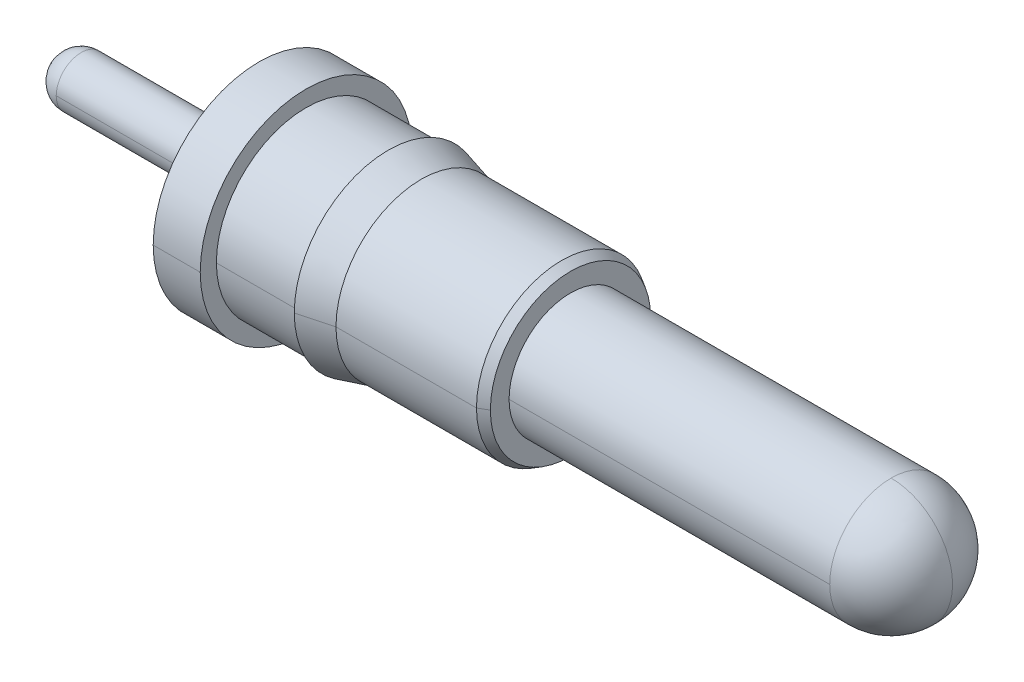
ISO-10303-21;
HEADER;
FILE_DESCRIPTION(('STEP AP214'),'2;1');
FILE_NAME('part.step','',(''),(''),'','','');
FILE_SCHEMA(('AUTOMOTIVE_DESIGN { 1 0 10303 214 1 1 1 1 }'));
ENDSEC;
DATA;
#1=APPLICATION_CONTEXT('core data for automotive mechanical design processes');
#2=APPLICATION_PROTOCOL_DEFINITION('international standard','automotive_design',2000,#1);
#3=PRODUCT_CONTEXT('',#1,'mechanical');
#4=PRODUCT('Part','Part','',(#3));
#5=PRODUCT_RELATED_PRODUCT_CATEGORY('part','',(#4));
#6=PRODUCT_DEFINITION_FORMATION('','',#4);
#7=PRODUCT_DEFINITION_CONTEXT('part definition',#1,'design');
#8=PRODUCT_DEFINITION('design','',#6,#7);
#9=PRODUCT_DEFINITION_SHAPE('','',#8);
#10=(LENGTH_UNIT() NAMED_UNIT(*) SI_UNIT(.MILLI.,.METRE.));
#11=(NAMED_UNIT(*) PLANE_ANGLE_UNIT() SI_UNIT($,.RADIAN.));
#12=(NAMED_UNIT(*) SI_UNIT($,.STERADIAN.) SOLID_ANGLE_UNIT());
#13=UNCERTAINTY_MEASURE_WITH_UNIT(LENGTH_MEASURE(1.E-05),#10,'distance_accuracy_value','');
#14=(GEOMETRIC_REPRESENTATION_CONTEXT(3) GLOBAL_UNCERTAINTY_ASSIGNED_CONTEXT((#13)) GLOBAL_UNIT_ASSIGNED_CONTEXT((#10,
#11,#12)) REPRESENTATION_CONTEXT('',''));
#15=CARTESIAN_POINT('',(0.,0.,0.));
#16=DIRECTION('',(0.,0.,1.));
#17=DIRECTION('',(1.,0.,0.));
#18=AXIS2_PLACEMENT_3D('',#15,#16,#17);
#19=CARTESIAN_POINT('',(0.215900000000005,0.215900000000005,0.));
#20=CARTESIAN_POINT('',(0.215900000000005,0.215900000000005,0.));
#21=CARTESIAN_POINT('',(0.215900000000005,0.215900000000005,0.));
#22=CARTESIAN_POINT('',(0.215900000000005,0.215900000000005,0.));
#23=CARTESIAN_POINT('',(0.215900000000004,0.215900000000005,-0.431800000000009));
#24=CARTESIAN_POINT('',(-0.647700000000014,0.215900000000005,-0.43180000000001));
#25=CARTESIAN_POINT('',(-0.647700000000014,0.215900000000005,0.43180000000001));
#26=CARTESIAN_POINT('',(0.215900000000005,0.215900000000005,0.431800000000009));
#27=CARTESIAN_POINT('',(0.215900000000004,-0.215900000000005,-0.431800000000009));
#28=CARTESIAN_POINT('',(-0.647700000000014,-0.215900000000005,-0.43180000000001));
#29=CARTESIAN_POINT('',(-0.647700000000014,-0.215900000000005,0.43180000000001));
#30=CARTESIAN_POINT('',(0.215900000000005,-0.215900000000005,0.431800000000009));
#31=CARTESIAN_POINT('',(0.215900000000005,-0.215900000000005,0.));
#32=CARTESIAN_POINT('',(0.215900000000005,-0.215900000000005,0.));
#33=CARTESIAN_POINT('',(0.215900000000005,-0.215900000000005,0.));
#34=CARTESIAN_POINT('',(0.215900000000005,-0.215900000000005,0.));
#35=(BOUNDED_SURFACE() B_SPLINE_SURFACE(3,3,((#19,#20,#21,#22),(#23,#24,#25,#26),(#27,#28,#29,
#30),(#31,#32,#33,#34)),.UNSPECIFIED.,.F.,.F.,.F.) B_SPLINE_SURFACE_WITH_KNOTS((4,4),(4,4),(0.,
1.),(0.,1.),.UNSPECIFIED.) GEOMETRIC_REPRESENTATION_ITEM() RATIONAL_B_SPLINE_SURFACE(((1.,
0.333333333333334,0.333333333333334,1.),(0.333333333333334,0.111111111111111,0.111111111111111,
0.333333333333334),(0.333333333333334,0.111111111111111,0.111111111111111,0.333333333333334),
(1.,0.333333333333334,0.333333333333334,1.))) REPRESENTATION_ITEM('') SURFACE());
#36=CARTESIAN_POINT('',(0.215900000000005,0.,0.));
#37=DIRECTION('',(1.,0.,0.));
#38=DIRECTION('',(0.,0.,1.));
#39=AXIS2_PLACEMENT_3D('',#36,#37,#38);
#40=CIRCLE('',#39,0.215900000000005);
#41=CARTESIAN_POINT('',(0.215900000000005,-0.215900000000005,0.));
#42=VERTEX_POINT('',#41);
#43=CARTESIAN_POINT('',(0.215900000000005,0.,-0.215900000000005));
#44=VERTEX_POINT('',#43);
#45=EDGE_CURVE('E10',#42,#44,#40,.T.);
#46=CARTESIAN_POINT('',(0.215900000000005,0.,0.));
#47=DIRECTION('',(1.,0.,0.));
#48=DIRECTION('',(0.,0.,1.));
#49=AXIS2_PLACEMENT_3D('',#46,#47,#48);
#50=CIRCLE('',#49,0.215900000000005);
#51=CARTESIAN_POINT('',(0.215900000000005,0.,0.215900000000005));
#52=VERTEX_POINT('',#51);
#53=EDGE_CURVE('E21',#52,#42,#50,.T.);
#54=CARTESIAN_POINT('',(0.215900000000005,0.,0.));
#55=DIRECTION('',(1.,0.,0.));
#56=DIRECTION('',(0.,0.,1.));
#57=AXIS2_PLACEMENT_3D('',#54,#55,#56);
#58=CIRCLE('',#57,0.215900000000005);
#59=CARTESIAN_POINT('',(0.215900000000005,0.215900000000005,0.));
#60=VERTEX_POINT('',#59);
#61=EDGE_CURVE('E284',#60,#52,#58,.T.);
#62=CARTESIAN_POINT('',(0.215900000000005,0.,0.));
#63=DIRECTION('',(1.,0.,0.));
#64=DIRECTION('',(0.,0.,1.));
#65=AXIS2_PLACEMENT_3D('',#62,#63,#64);
#66=CIRCLE('',#65,0.215900000000005);
#67=EDGE_CURVE('E280',#44,#60,#66,.T.);
#68=ORIENTED_EDGE('',*,*,#45,.F.);
#69=ORIENTED_EDGE('',*,*,#53,.F.);
#70=ORIENTED_EDGE('',*,*,#61,.F.);
#71=ORIENTED_EDGE('',*,*,#67,.F.);
#72=EDGE_LOOP('',(#68,#69,#70,#71));
#73=FACE_BOUND('',#72,.T.);
#74=ADVANCED_FACE('F16',(#73),#35,.T.);
#75=CARTESIAN_POINT('',(0.,0.,0.));
#76=DIRECTION('',(-1.,0.,0.));
#77=DIRECTION('',(0.,0.,1.));
#78=AXIS2_PLACEMENT_3D('',#75,#76,#77);
#79=CYLINDRICAL_SURFACE('',#78,0.215900000000005);
#80=DIRECTION('',(-1.,0.,0.));
#81=VECTOR('',#80,1.);
#82=CARTESIAN_POINT('',(0.,0.,-0.215900000000005));
#83=LINE('',#82,#81);
#84=CARTESIAN_POINT('',(1.67640000000003,0.,-0.215900000000005));
#85=VERTEX_POINT('',#84);
#86=EDGE_CURVE('E285',#85,#44,#83,.T.);
#87=ORIENTED_EDGE('',*,*,#86,.F.);
#88=CARTESIAN_POINT('',(1.67640000000003,0.,0.));
#89=DIRECTION('',(-1.,0.,0.));
#90=DIRECTION('',(0.,0.,1.));
#91=AXIS2_PLACEMENT_3D('',#88,#89,#90);
#92=CIRCLE('',#91,0.215900000000005);
#93=CARTESIAN_POINT('',(1.67640000000003,0.,0.215900000000005));
#94=VERTEX_POINT('',#93);
#95=EDGE_CURVE('E339',#85,#94,#92,.T.);
#96=ORIENTED_EDGE('',*,*,#95,.T.);
#97=DIRECTION('',(-1.,0.,0.));
#98=VECTOR('',#97,1.);
#99=CARTESIAN_POINT('',(0.,0.,0.215900000000005));
#100=LINE('',#99,#98);
#101=EDGE_CURVE('E312',#94,#52,#100,.T.);
#102=ORIENTED_EDGE('',*,*,#101,.T.);
#103=ORIENTED_EDGE('',*,*,#53,.T.);
#104=ORIENTED_EDGE('',*,*,#45,.T.);
#105=EDGE_LOOP('',(#87,#96,#102,#103,#104));
#106=FACE_BOUND('',#105,.T.);
#107=ADVANCED_FACE('F352',(#106),#79,.T.);
#108=CARTESIAN_POINT('',(1.75260000000003,0.,-0.292100000000005));
#109=CARTESIAN_POINT('',(1.75260000000003,-0.584200000000011,-0.292100000000005));
#110=CARTESIAN_POINT('',(1.75260000000003,-0.584200000000011,0.292100000000005));
#111=CARTESIAN_POINT('',(1.75260000000003,0.,0.292100000000005));
#112=CARTESIAN_POINT('',(1.75260000000003,0.,-0.247463073452835));
#113=CARTESIAN_POINT('',(1.75260000000003,-0.494926146905669,-0.247463073452835));
#114=CARTESIAN_POINT('',(1.75260000000003,-0.494926146905669,0.247463073452835));
#115=CARTESIAN_POINT('',(1.75260000000003,0.,0.247463073452835));
#116=CARTESIAN_POINT('',(1.7210369265472,0.,-0.215900000000005));
#117=CARTESIAN_POINT('',(1.7210369265472,-0.431800000000009,-0.215900000000005));
#118=CARTESIAN_POINT('',(1.7210369265472,-0.431800000000009,0.215900000000005));
#119=CARTESIAN_POINT('',(1.7210369265472,0.,0.215900000000005));
#120=CARTESIAN_POINT('',(1.67640000000003,0.,-0.215900000000005));
#121=CARTESIAN_POINT('',(1.67640000000003,-0.431800000000009,-0.215900000000005));
#122=CARTESIAN_POINT('',(1.67640000000003,-0.431800000000009,0.215900000000005));
#123=CARTESIAN_POINT('',(1.67640000000003,0.,0.215900000000005));
#124=(BOUNDED_SURFACE() B_SPLINE_SURFACE(3,3,((#108,#109,#110,#111),(#112,#113,#114,#115),(#116,
#117,#118,#119),(#120,#121,#122,#123)),.UNSPECIFIED.,.F.,.F.,
.F.) B_SPLINE_SURFACE_WITH_KNOTS((4,4),(4,4),(0.,1.),(0.,1.),
.UNSPECIFIED.) GEOMETRIC_REPRESENTATION_ITEM() RATIONAL_B_SPLINE_SURFACE(((1.,0.333333333333334,
0.333333333333334,1.),(0.804737854124365,0.268245951374788,0.268245951374788,0.804737854124365),
(0.804737854124365,0.268245951374788,0.268245951374788,0.804737854124365),(1.,0.333333333333334,
0.333333333333334,1.))) REPRESENTATION_ITEM('') SURFACE());
#125=CARTESIAN_POINT('',(1.67640000000003,0.,-0.292100000000005));
#126=DIRECTION('',(0.,-1.,0.));
#127=DIRECTION('',(0.,0.,-1.));
#128=AXIS2_PLACEMENT_3D('',#125,#126,#127);
#129=CIRCLE('',#128,0.0762);
#130=CARTESIAN_POINT('',(1.75260000000003,0.,-0.292100000000005));
#131=VERTEX_POINT('',#130);
#132=EDGE_CURVE('E207',#131,#85,#129,.T.);
#133=CARTESIAN_POINT('',(1.75260000000003,0.,-0.292100000000005));
#134=CARTESIAN_POINT('',(1.75260000000003,-0.584200000000011,-0.292100000000005));
#135=CARTESIAN_POINT('',(1.75260000000003,-0.584200000000011,0.292100000000005));
#136=CARTESIAN_POINT('',(1.75260000000003,0.,0.292100000000005));
#137=(BOUNDED_CURVE() B_SPLINE_CURVE(3,(#133,#134,#135,#136),.UNSPECIFIED.,.F.,
.F.) B_SPLINE_CURVE_WITH_KNOTS((4,4),(0.,1.),
.UNSPECIFIED.) CURVE() GEOMETRIC_REPRESENTATION_ITEM() RATIONAL_B_SPLINE_CURVE((1.,
0.333333333333334,0.333333333333334,1.)) REPRESENTATION_ITEM(''));
#138=CARTESIAN_POINT('',(1.75260000000003,0.,0.292100000000005));
#139=VERTEX_POINT('',#138);
#140=EDGE_CURVE('E335',#131,#139,#137,.T.);
#141=CARTESIAN_POINT('',(1.67640000000003,0.,0.292100000000005));
#142=DIRECTION('',(0.,1.,0.));
#143=DIRECTION('',(0.,0.,1.));
#144=AXIS2_PLACEMENT_3D('',#141,#142,#143);
#145=CIRCLE('',#144,0.0762);
#146=EDGE_CURVE('E206',#139,#94,#145,.T.);
#147=ORIENTED_EDGE('',*,*,#132,.F.);
#148=ORIENTED_EDGE('',*,*,#140,.T.);
#149=ORIENTED_EDGE('',*,*,#146,.T.);
#150=ORIENTED_EDGE('',*,*,#95,.F.);
#151=EDGE_LOOP('',(#147,#148,#149,#150));
#152=FACE_BOUND('',#151,.T.);
#153=ADVANCED_FACE('F362',(#152),#124,.F.);
#154=CARTESIAN_POINT('',(1.75260000000003,0.9144,0.));
#155=DIRECTION('',(1.,0.,0.));
#156=DIRECTION('',(0.,1.,0.));
#157=AXIS2_PLACEMENT_3D('',#154,#155,#156);
#158=PLANE('',#157);
#159=ORIENTED_EDGE('',*,*,#140,.F.);
#160=CARTESIAN_POINT('',(1.75260000000003,0.,0.292100000000005));
#161=CARTESIAN_POINT('',(1.75260000000003,0.584200000000011,0.292100000000005));
#162=CARTESIAN_POINT('',(1.75260000000003,0.584200000000011,-0.292100000000005));
#163=CARTESIAN_POINT('',(1.75260000000003,0.,-0.292100000000005));
#164=(BOUNDED_CURVE() B_SPLINE_CURVE(3,(#160,#161,#162,#163),.UNSPECIFIED.,.F.,
.F.) B_SPLINE_CURVE_WITH_KNOTS((4,4),(0.,1.),
.UNSPECIFIED.) CURVE() GEOMETRIC_REPRESENTATION_ITEM() RATIONAL_B_SPLINE_CURVE((1.,
0.333333333333334,0.333333333333334,1.)) REPRESENTATION_ITEM(''));
#165=EDGE_CURVE('E201',#139,#131,#164,.T.);
#166=ORIENTED_EDGE('',*,*,#165,.F.);
#167=EDGE_LOOP('',(#159,#166));
#168=FACE_BOUND('',#167,.T.);
#169=CARTESIAN_POINT('',(1.75260000000003,0.,0.));
#170=DIRECTION('',(1.,0.,0.));
#171=DIRECTION('',(0.,0.,1.));
#172=AXIS2_PLACEMENT_3D('',#169,#170,#171);
#173=CIRCLE('',#172,0.9144);
#174=CARTESIAN_POINT('',(1.75260000000003,0.,0.9144));
#175=VERTEX_POINT('',#174);
#176=CARTESIAN_POINT('',(1.75260000000003,0.,-0.9144));
#177=VERTEX_POINT('',#176);
#178=EDGE_CURVE('E332',#175,#177,#173,.T.);
#179=ORIENTED_EDGE('',*,*,#178,.F.);
#180=CARTESIAN_POINT('',(1.75260000000003,0.,0.));
#181=DIRECTION('',(1.,0.,0.));
#182=DIRECTION('',(0.,0.,1.));
#183=AXIS2_PLACEMENT_3D('',#180,#181,#182);
#184=CIRCLE('',#183,0.9144);
#185=EDGE_CURVE('E293',#177,#175,#184,.T.);
#186=ORIENTED_EDGE('',*,*,#185,.F.);
#187=EDGE_LOOP('',(#179,#186));
#188=FACE_BOUND('',#187,.T.);
#189=ADVANCED_FACE('F364',(#168,#188),#158,.F.);
#190=CARTESIAN_POINT('',(0.,0.,0.));
#191=DIRECTION('',(-1.,0.,0.));
#192=DIRECTION('',(0.,0.,1.));
#193=AXIS2_PLACEMENT_3D('',#190,#191,#192);
#194=CYLINDRICAL_SURFACE('',#193,0.9144);
#195=DIRECTION('',(-1.,0.,0.));
#196=VECTOR('',#195,1.);
#197=CARTESIAN_POINT('',(0.,0.,-0.9144));
#198=LINE('',#197,#196);
#199=CARTESIAN_POINT('',(2.15900000000003,0.,-0.9144));
#200=VERTEX_POINT('',#199);
#201=EDGE_CURVE('E288',#200,#177,#198,.T.);
#202=ORIENTED_EDGE('',*,*,#201,.F.);
#203=CARTESIAN_POINT('',(2.15900000000003,0.,0.));
#204=DIRECTION('',(-1.,0.,0.));
#205=DIRECTION('',(0.,0.,1.));
#206=AXIS2_PLACEMENT_3D('',#203,#204,#205);
#207=CIRCLE('',#206,0.9144);
#208=CARTESIAN_POINT('',(2.15900000000003,0.,0.9144));
#209=VERTEX_POINT('',#208);
#210=EDGE_CURVE('E329',#200,#209,#207,.T.);
#211=ORIENTED_EDGE('',*,*,#210,.T.);
#212=DIRECTION('',(-1.,0.,0.));
#213=VECTOR('',#212,1.);
#214=CARTESIAN_POINT('',(0.,0.,0.9144));
#215=LINE('',#214,#213);
#216=EDGE_CURVE('E297',#209,#175,#215,.T.);
#217=ORIENTED_EDGE('',*,*,#216,.T.);
#218=ORIENTED_EDGE('',*,*,#178,.T.);
#219=EDGE_LOOP('',(#202,#211,#217,#218));
#220=FACE_BOUND('',#219,.T.);
#221=ADVANCED_FACE('F367',(#220),#194,.T.);
#222=CARTESIAN_POINT('',(2.15900000000003,0.9144,0.));
#223=DIRECTION('',(-1.,0.,0.));
#224=DIRECTION('',(0.,0.,1.));
#225=AXIS2_PLACEMENT_3D('',#222,#223,#224);
#226=PLANE('',#225);
#227=CARTESIAN_POINT('',(2.15900000000003,0.,0.));
#228=DIRECTION('',(1.,0.,0.));
#229=DIRECTION('',(0.,0.,1.));
#230=AXIS2_PLACEMENT_3D('',#227,#228,#229);
#231=CIRCLE('',#230,0.7747);
#232=CARTESIAN_POINT('',(2.15900000000003,0.,0.7747));
#233=VERTEX_POINT('',#232);
#234=CARTESIAN_POINT('',(2.15900000000003,0.,-0.7747));
#235=VERTEX_POINT('',#234);
#236=EDGE_CURVE('E326',#233,#235,#231,.T.);
#237=ORIENTED_EDGE('',*,*,#236,.F.);
#238=CARTESIAN_POINT('',(2.15900000000003,0.,0.));
#239=DIRECTION('',(1.,0.,0.));
#240=DIRECTION('',(0.,0.,1.));
#241=AXIS2_PLACEMENT_3D('',#238,#239,#240);
#242=CIRCLE('',#241,0.7747);
#243=EDGE_CURVE('E271',#235,#233,#242,.T.);
#244=ORIENTED_EDGE('',*,*,#243,.F.);
#245=EDGE_LOOP('',(#237,#244));
#246=FACE_BOUND('',#245,.T.);
#247=CARTESIAN_POINT('',(2.15900000000003,0.,0.));
#248=DIRECTION('',(-1.,0.,0.));
#249=DIRECTION('',(0.,0.,1.));
#250=AXIS2_PLACEMENT_3D('',#247,#248,#249);
#251=CIRCLE('',#250,0.9144);
#252=EDGE_CURVE('E279',#209,#200,#251,.T.);
#253=ORIENTED_EDGE('',*,*,#252,.F.);
#254=ORIENTED_EDGE('',*,*,#210,.F.);
#255=EDGE_LOOP('',(#253,#254));
#256=FACE_BOUND('',#255,.T.);
#257=ADVANCED_FACE('F377',(#246,#256),#226,.F.);
#258=CARTESIAN_POINT('',(0.,0.,0.));
#259=DIRECTION('',(-1.,0.,0.));
#260=DIRECTION('',(0.,0.,1.));
#261=AXIS2_PLACEMENT_3D('',#258,#259,#260);
#262=CYLINDRICAL_SURFACE('',#261,0.7747);
#263=DIRECTION('',(-1.,0.,0.));
#264=VECTOR('',#263,1.);
#265=CARTESIAN_POINT('',(0.,0.,-0.7747));
#266=LINE('',#265,#264);
#267=CARTESIAN_POINT('',(2.8702,0.,-0.7747));
#268=VERTEX_POINT('',#267);
#269=EDGE_CURVE('E267',#268,#235,#266,.T.);
#270=ORIENTED_EDGE('',*,*,#269,.F.);
#271=CARTESIAN_POINT('',(2.8702,0.,0.));
#272=DIRECTION('',(-1.,0.,0.));
#273=DIRECTION('',(0.,0.,1.));
#274=AXIS2_PLACEMENT_3D('',#271,#272,#273);
#275=CIRCLE('',#274,0.7747);
#276=CARTESIAN_POINT('',(2.8702,0.,0.7747));
#277=VERTEX_POINT('',#276);
#278=EDGE_CURVE('E304',#268,#277,#275,.T.);
#279=ORIENTED_EDGE('',*,*,#278,.T.);
#280=DIRECTION('',(-1.,0.,0.));
#281=VECTOR('',#280,1.);
#282=CARTESIAN_POINT('',(0.,0.,0.7747));
#283=LINE('',#282,#281);
#284=EDGE_CURVE('E275',#277,#233,#283,.T.);
#285=ORIENTED_EDGE('',*,*,#284,.T.);
#286=ORIENTED_EDGE('',*,*,#236,.T.);
#287=EDGE_LOOP('',(#270,#279,#285,#286));
#288=FACE_BOUND('',#287,.T.);
#289=ADVANCED_FACE('F379',(#288),#262,.T.);
#290=CARTESIAN_POINT('',(2.8702,0.7747,0.));
#291=DIRECTION('',(1.,0.,0.));
#292=DIRECTION('',(0.,1.,0.));
#293=AXIS2_PLACEMENT_3D('',#290,#291,#292);
#294=PLANE('',#293);
#295=CARTESIAN_POINT('',(2.8702,0.,0.));
#296=DIRECTION('',(-1.,0.,0.));
#297=DIRECTION('',(0.,0.,1.));
#298=AXIS2_PLACEMENT_3D('',#295,#296,#297);
#299=CIRCLE('',#298,0.7747);
#300=EDGE_CURVE('E241',#277,#268,#299,.T.);
#301=ORIENTED_EDGE('',*,*,#300,.F.);
#302=ORIENTED_EDGE('',*,*,#278,.F.);
#303=EDGE_LOOP('',(#301,#302));
#304=FACE_BOUND('',#303,.T.);
#305=CARTESIAN_POINT('',(2.87020000001803,0.,0.));
#306=DIRECTION('',(1.,0.,0.));
#307=DIRECTION('',(0.,0.,1.));
#308=AXIS2_PLACEMENT_3D('',#305,#306,#307);
#309=CIRCLE('',#308,0.812799999979228);
#310=CARTESIAN_POINT('',(2.87020000001803,0.,0.812799999979228));
#311=VERTEX_POINT('',#310);
#312=CARTESIAN_POINT('',(2.87020000001803,0.,-0.812799999979228));
#313=VERTEX_POINT('',#312);
#314=EDGE_CURVE('E301',#311,#313,#309,.T.);
#315=ORIENTED_EDGE('',*,*,#314,.F.);
#316=CARTESIAN_POINT('',(2.87020000001803,0.,0.));
#317=DIRECTION('',(1.,0.,0.));
#318=DIRECTION('',(0.,0.,1.));
#319=AXIS2_PLACEMENT_3D('',#316,#317,#318);
#320=CIRCLE('',#319,0.812799999979228);
#321=EDGE_CURVE('E242',#313,#311,#320,.T.);
#322=ORIENTED_EDGE('',*,*,#321,.F.);
#323=EDGE_LOOP('',(#315,#322));
#324=FACE_BOUND('',#323,.T.);
#325=ADVANCED_FACE('F387',(#304,#324),#294,.F.);
#326=CARTESIAN_POINT('',(2.87020000013172,0.,0.));
#327=DIRECTION('',(-1.,0.,0.));
#328=DIRECTION('',(0.,0.,1.));
#329=AXIS2_PLACEMENT_3D('',#326,#327,#328);
#330=CONICAL_SURFACE('',#329,0.812799999948766,0.261799387763808);
#331=DIRECTION('',(-0.965925826298215,0.,-0.258819045068383));
#332=VECTOR('',#331,1.);
#333=CARTESIAN_POINT('',(2.87020000013172,0.,-0.812799999948766));
#334=LINE('',#333,#332);
#335=CARTESIAN_POINT('',(3.15458227153652,0.,-0.7366));
#336=VERTEX_POINT('',#335);
#337=EDGE_CURVE('E257',#336,#313,#334,.T.);
#338=ORIENTED_EDGE('',*,*,#337,.F.);
#339=CARTESIAN_POINT('',(3.15458227153652,0.,0.));
#340=DIRECTION('',(1.,0.,0.));
#341=DIRECTION('',(0.,0.,1.));
#342=AXIS2_PLACEMENT_3D('',#339,#340,#341);
#343=CIRCLE('',#342,0.7366);
#344=CARTESIAN_POINT('',(3.15458227153652,0.,0.7366));
#345=VERTEX_POINT('',#344);
#346=EDGE_CURVE('E305',#345,#336,#343,.T.);
#347=ORIENTED_EDGE('',*,*,#346,.F.);
#348=DIRECTION('',(-0.965925826298215,0.,0.258819045068383));
#349=VECTOR('',#348,1.);
#350=CARTESIAN_POINT('',(2.87020000013172,0.,0.812799999948766));
#351=LINE('',#350,#349);
#352=EDGE_CURVE('E237',#345,#311,#351,.T.);
#353=ORIENTED_EDGE('',*,*,#352,.T.);
#354=ORIENTED_EDGE('',*,*,#314,.T.);
#355=EDGE_LOOP('',(#338,#347,#353,#354));
#356=FACE_BOUND('',#355,.T.);
#357=ADVANCED_FACE('F447',(#356),#330,.T.);
#358=CARTESIAN_POINT('',(0.,0.,0.));
#359=DIRECTION('',(-1.,0.,0.));
#360=DIRECTION('',(0.,0.,1.));
#361=AXIS2_PLACEMENT_3D('',#358,#359,#360);
#362=CYLINDRICAL_SURFACE('',#361,0.7366);
#363=DIRECTION('',(-1.,0.,0.));
#364=VECTOR('',#363,1.);
#365=CARTESIAN_POINT('',(0.,0.,-0.7366));
#366=LINE('',#365,#364);
#367=CARTESIAN_POINT('',(4.36879999995199,0.,-0.736600000038834));
#368=VERTEX_POINT('',#367);
#369=EDGE_CURVE('E192',#368,#336,#366,.T.);
#370=ORIENTED_EDGE('',*,*,#369,.F.);
#371=CARTESIAN_POINT('',(4.36879999995199,0.,0.));
#372=DIRECTION('',(1.,0.,0.));
#373=DIRECTION('',(0.,0.,1.));
#374=AXIS2_PLACEMENT_3D('',#371,#372,#373);
#375=CIRCLE('',#374,0.736600000038834);
#376=CARTESIAN_POINT('',(4.36879999995199,0.,0.736600000038834));
#377=VERTEX_POINT('',#376);
#378=EDGE_CURVE('E319',#377,#368,#375,.T.);
#379=ORIENTED_EDGE('',*,*,#378,.F.);
#380=DIRECTION('',(-1.,0.,0.));
#381=VECTOR('',#380,1.);
#382=CARTESIAN_POINT('',(0.,0.,0.7366));
#383=LINE('',#382,#381);
#384=EDGE_CURVE('E250',#377,#345,#383,.T.);
#385=ORIENTED_EDGE('',*,*,#384,.T.);
#386=ORIENTED_EDGE('',*,*,#346,.T.);
#387=EDGE_LOOP('',(#370,#379,#385,#386));
#388=FACE_BOUND('',#387,.T.);
#389=ADVANCED_FACE('F459',(#388),#362,.T.);
#390=CARTESIAN_POINT('',(4.36880000012252,0.,0.));
#391=DIRECTION('',(-1.,0.,0.));
#392=DIRECTION('',(0.,0.,1.));
#393=AXIS2_PLACEMENT_3D('',#390,#391,#392);
#394=CONICAL_SURFACE('',#393,0.736599999925147,0.523598775295642);
#395=DIRECTION('',(-0.866025403935767,0.,-0.499999999737891));
#396=VECTOR('',#395,1.);
#397=CARTESIAN_POINT('',(4.36880000012252,0.,-0.736599999925147));
#398=LINE('',#397,#396);
#399=CARTESIAN_POINT('',(4.44500000003245,0.,-0.692605909495649));
#400=VERTEX_POINT('',#399);
#401=EDGE_CURVE('E231',#400,#368,#398,.T.);
#402=ORIENTED_EDGE('',*,*,#401,.F.);
#403=CARTESIAN_POINT('',(4.44500000003245,0.,0.));
#404=DIRECTION('',(-1.,0.,0.));
#405=DIRECTION('',(0.,0.,1.));
#406=AXIS2_PLACEMENT_3D('',#403,#404,#405);
#407=CIRCLE('',#406,0.692605909495649);
#408=CARTESIAN_POINT('',(4.44500000003245,0.,0.692605909495649));
#409=VERTEX_POINT('',#408);
#410=EDGE_CURVE('E219',#400,#409,#407,.T.);
#411=ORIENTED_EDGE('',*,*,#410,.T.);
#412=DIRECTION('',(-0.866025403935767,0.,0.499999999737891));
#413=VECTOR('',#412,1.);
#414=CARTESIAN_POINT('',(4.36880000012252,0.,0.736599999925147));
#415=LINE('',#414,#413);
#416=EDGE_CURVE('E230',#409,#377,#415,.T.);
#417=ORIENTED_EDGE('',*,*,#416,.T.);
#418=ORIENTED_EDGE('',*,*,#378,.T.);
#419=EDGE_LOOP('',(#402,#411,#417,#418));
#420=FACE_BOUND('',#419,.T.);
#421=ADVANCED_FACE('F469',(#420),#394,.T.);
#422=CARTESIAN_POINT('',(4.445,0.692605909487749,0.));
#423=DIRECTION('',(-1.,0.,0.));
#424=DIRECTION('',(0.,0.,1.));
#425=AXIS2_PLACEMENT_3D('',#422,#423,#424);
#426=PLANE('',#425);
#427=CARTESIAN_POINT('',(4.445,0.,0.));
#428=DIRECTION('',(1.,0.,0.));
#429=DIRECTION('',(0.,0.,1.));
#430=AXIS2_PLACEMENT_3D('',#427,#428,#429);
#431=CIRCLE('',#430,0.53086);
#432=CARTESIAN_POINT('',(4.445,0.,0.53086));
#433=VERTEX_POINT('',#432);
#434=CARTESIAN_POINT('',(4.445,0.,-0.53086));
#435=VERTEX_POINT('',#434);
#436=EDGE_CURVE('E213',#433,#435,#431,.T.);
#437=ORIENTED_EDGE('',*,*,#436,.F.);
#438=CARTESIAN_POINT('',(4.445,0.,0.));
#439=DIRECTION('',(1.,0.,0.));
#440=DIRECTION('',(0.,0.,1.));
#441=AXIS2_PLACEMENT_3D('',#438,#439,#440);
#442=CIRCLE('',#441,0.53086);
#443=EDGE_CURVE('E195',#435,#433,#442,.T.);
#444=ORIENTED_EDGE('',*,*,#443,.F.);
#445=EDGE_LOOP('',(#437,#444));
#446=FACE_BOUND('',#445,.T.);
#447=CARTESIAN_POINT('',(4.44500000003245,0.,0.));
#448=DIRECTION('',(-1.,0.,0.));
#449=DIRECTION('',(0.,0.,1.));
#450=AXIS2_PLACEMENT_3D('',#447,#448,#449);
#451=CIRCLE('',#450,0.692605909495649);
#452=EDGE_CURVE('E172',#409,#400,#451,.T.);
#453=ORIENTED_EDGE('',*,*,#452,.F.);
#454=ORIENTED_EDGE('',*,*,#410,.F.);
#455=EDGE_LOOP('',(#453,#454));
#456=FACE_BOUND('',#455,.T.);
#457=ADVANCED_FACE('F480',(#446,#456),#426,.F.);
#458=CARTESIAN_POINT('',(7.21614,0.53086,0.));
#459=CARTESIAN_POINT('',(7.21614000000003,0.53086,0.));
#460=CARTESIAN_POINT('',(7.21614000000003,0.53086,0.));
#461=CARTESIAN_POINT('',(7.21614,0.53086,0.));
#462=CARTESIAN_POINT('',(7.21613999999999,0.53086,1.06172));
#463=CARTESIAN_POINT('',(7.83808117655727,0.53086,1.06172));
#464=CARTESIAN_POINT('',(8.27786000000003,0.53086,0.621941176557236));
#465=CARTESIAN_POINT('',(8.27786000000002,0.53086,0.));
#466=CARTESIAN_POINT('',(7.21613999999999,-0.53086,1.06172));
#467=CARTESIAN_POINT('',(7.83808117655727,-0.53086,1.06172));
#468=CARTESIAN_POINT('',(8.27786000000003,-0.53086,0.621941176557236));
#469=CARTESIAN_POINT('',(8.27786000000002,-0.53086,0.));
#470=CARTESIAN_POINT('',(7.21614,-0.53086,0.));
#471=CARTESIAN_POINT('',(7.21614000000003,-0.53086,0.));
#472=CARTESIAN_POINT('',(7.21614000000003,-0.53086,0.));
#473=CARTESIAN_POINT('',(7.21614,-0.53086,0.));
#474=(BOUNDED_SURFACE() B_SPLINE_SURFACE(3,3,((#458,#459,#460,#461),(#462,#463,#464,#465),(#466,
#467,#468,#469),(#470,#471,#472,#473)),.UNSPECIFIED.,.F.,.F.,
.F.) B_SPLINE_SURFACE_WITH_KNOTS((4,4),(4,4),(0.,1.),(0.,1.),
.UNSPECIFIED.) GEOMETRIC_REPRESENTATION_ITEM() RATIONAL_B_SPLINE_SURFACE(((1.,0.804737854124365,
0.804737854124365,1.),(0.333333333333334,0.268245951374788,0.268245951374788,0.333333333333334),
(0.333333333333334,0.268245951374788,0.268245951374788,0.333333333333334),(1.,0.804737854124365,
0.804737854124365,1.))) REPRESENTATION_ITEM('') SURFACE());
#475=CARTESIAN_POINT('',(7.21614,0.,0.));
#476=DIRECTION('',(0.,0.,-1.));
#477=DIRECTION('',(0.,1.,0.));
#478=AXIS2_PLACEMENT_3D('',#475,#476,#477);
#479=CIRCLE('',#478,0.53086);
#480=CARTESIAN_POINT('',(7.21614,0.53086,0.));
#481=VERTEX_POINT('',#480);
#482=CARTESIAN_POINT('',(7.21614,-0.53086,0.));
#483=VERTEX_POINT('',#482);
#484=EDGE_CURVE('E175',#481,#483,#479,.T.);
#485=CARTESIAN_POINT('',(7.21614,0.,0.));
#486=DIRECTION('',(-1.,0.,0.));
#487=DIRECTION('',(0.,0.,1.));
#488=AXIS2_PLACEMENT_3D('',#485,#486,#487);
#489=CIRCLE('',#488,0.53086);
#490=CARTESIAN_POINT('',(7.21614,0.,0.53086));
#491=VERTEX_POINT('',#490);
#492=EDGE_CURVE('E161',#491,#481,#489,.T.);
#493=CARTESIAN_POINT('',(7.21614,0.,0.));
#494=DIRECTION('',(-1.,0.,0.));
#495=DIRECTION('',(0.,0.,1.));
#496=AXIS2_PLACEMENT_3D('',#493,#494,#495);
#497=CIRCLE('',#496,0.53086);
#498=EDGE_CURVE('E177',#483,#491,#497,.T.);
#499=ORIENTED_EDGE('',*,*,#484,.F.);
#500=ORIENTED_EDGE('',*,*,#492,.F.);
#501=ORIENTED_EDGE('',*,*,#498,.F.);
#502=EDGE_LOOP('',(#499,#500,#501));
#503=FACE_BOUND('',#502,.T.);
#504=ADVANCED_FACE('F176',(#503),#474,.T.);
#505=CARTESIAN_POINT('',(0.,0.,0.));
#506=DIRECTION('',(-1.,0.,0.));
#507=DIRECTION('',(0.,0.,1.));
#508=AXIS2_PLACEMENT_3D('',#505,#506,#507);
#509=CYLINDRICAL_SURFACE('',#508,0.53086);
#510=DIRECTION('',(-1.,0.,0.));
#511=VECTOR('',#510,1.);
#512=CARTESIAN_POINT('',(0.,0.,-0.53086));
#513=LINE('',#512,#511);
#514=CARTESIAN_POINT('',(7.21614,0.,-0.53086));
#515=VERTEX_POINT('',#514);
#516=EDGE_CURVE('E197',#515,#435,#513,.T.);
#517=ORIENTED_EDGE('',*,*,#516,.F.);
#518=CARTESIAN_POINT('',(7.21614,0.,0.));
#519=DIRECTION('',(-1.,0.,0.));
#520=DIRECTION('',(0.,0.,1.));
#521=AXIS2_PLACEMENT_3D('',#518,#519,#520);
#522=CIRCLE('',#521,0.53086);
#523=EDGE_CURVE('E182',#515,#483,#522,.T.);
#524=ORIENTED_EDGE('',*,*,#523,.T.);
#525=ORIENTED_EDGE('',*,*,#498,.T.);
#526=DIRECTION('',(-1.,0.,0.));
#527=VECTOR('',#526,1.);
#528=CARTESIAN_POINT('',(0.,0.,0.53086));
#529=LINE('',#528,#527);
#530=EDGE_CURVE('E169',#491,#433,#529,.T.);
#531=ORIENTED_EDGE('',*,*,#530,.T.);
#532=ORIENTED_EDGE('',*,*,#436,.T.);
#533=EDGE_LOOP('',(#517,#524,#525,#531,#532));
#534=FACE_BOUND('',#533,.T.);
#535=ADVANCED_FACE('F503',(#534),#509,.T.);
#536=CARTESIAN_POINT('',(0.,0.,0.));
#537=DIRECTION('',(-1.,0.,0.));
#538=DIRECTION('',(0.,0.,1.));
#539=AXIS2_PLACEMENT_3D('',#536,#537,#538);
#540=CYLINDRICAL_SURFACE('',#539,0.215900000000005);
#541=CARTESIAN_POINT('',(1.67640000000003,0.,0.));
#542=DIRECTION('',(-1.,0.,0.));
#543=DIRECTION('',(0.,0.,1.));
#544=AXIS2_PLACEMENT_3D('',#541,#542,#543);
#545=CIRCLE('',#544,0.215900000000005);
#546=EDGE_CURVE('E202',#94,#85,#545,.T.);
#547=ORIENTED_EDGE('',*,*,#546,.T.);
#548=ORIENTED_EDGE('',*,*,#86,.T.);
#549=ORIENTED_EDGE('',*,*,#67,.T.);
#550=ORIENTED_EDGE('',*,*,#61,.T.);
#551=ORIENTED_EDGE('',*,*,#101,.F.);
#552=EDGE_LOOP('',(#547,#548,#549,#550,#551));
#553=FACE_BOUND('',#552,.T.);
#554=ADVANCED_FACE('F354',(#553),#540,.T.);
#555=CARTESIAN_POINT('',(0.,0.,0.));
#556=DIRECTION('',(-1.,0.,0.));
#557=DIRECTION('',(0.,0.,1.));
#558=AXIS2_PLACEMENT_3D('',#555,#556,#557);
#559=CYLINDRICAL_SURFACE('',#558,0.9144);
#560=ORIENTED_EDGE('',*,*,#252,.T.);
#561=ORIENTED_EDGE('',*,*,#201,.T.);
#562=ORIENTED_EDGE('',*,*,#185,.T.);
#563=ORIENTED_EDGE('',*,*,#216,.F.);
#564=EDGE_LOOP('',(#560,#561,#562,#563));
#565=FACE_BOUND('',#564,.T.);
#566=ADVANCED_FACE('F375',(#565),#559,.T.);
#567=CARTESIAN_POINT('',(0.,0.,0.));
#568=DIRECTION('',(-1.,0.,0.));
#569=DIRECTION('',(0.,0.,1.));
#570=AXIS2_PLACEMENT_3D('',#567,#568,#569);
#571=CYLINDRICAL_SURFACE('',#570,0.7747);
#572=ORIENTED_EDGE('',*,*,#300,.T.);
#573=ORIENTED_EDGE('',*,*,#269,.T.);
#574=ORIENTED_EDGE('',*,*,#243,.T.);
#575=ORIENTED_EDGE('',*,*,#284,.F.);
#576=EDGE_LOOP('',(#572,#573,#574,#575));
#577=FACE_BOUND('',#576,.T.);
#578=ADVANCED_FACE('F531',(#577),#571,.T.);
#579=CARTESIAN_POINT('',(2.87020000013172,0.,0.));
#580=DIRECTION('',(-1.,0.,0.));
#581=DIRECTION('',(0.,0.,1.));
#582=AXIS2_PLACEMENT_3D('',#579,#580,#581);
#583=CONICAL_SURFACE('',#582,0.812799999948766,0.261799387763808);
#584=CARTESIAN_POINT('',(3.15458227153652,0.,0.));
#585=DIRECTION('',(1.,0.,0.));
#586=DIRECTION('',(0.,0.,1.));
#587=AXIS2_PLACEMENT_3D('',#584,#585,#586);
#588=CIRCLE('',#587,0.7366);
#589=EDGE_CURVE('E246',#336,#345,#588,.T.);
#590=ORIENTED_EDGE('',*,*,#589,.F.);
#591=ORIENTED_EDGE('',*,*,#337,.T.);
#592=ORIENTED_EDGE('',*,*,#321,.T.);
#593=ORIENTED_EDGE('',*,*,#352,.F.);
#594=EDGE_LOOP('',(#590,#591,#592,#593));
#595=FACE_BOUND('',#594,.T.);
#596=ADVANCED_FACE('F541',(#595),#583,.T.);
#597=CARTESIAN_POINT('',(0.,0.,0.));
#598=DIRECTION('',(-1.,0.,0.));
#599=DIRECTION('',(0.,0.,1.));
#600=AXIS2_PLACEMENT_3D('',#597,#598,#599);
#601=CYLINDRICAL_SURFACE('',#600,0.7366);
#602=CARTESIAN_POINT('',(4.36879999995199,0.,0.));
#603=DIRECTION('',(1.,0.,0.));
#604=DIRECTION('',(0.,0.,1.));
#605=AXIS2_PLACEMENT_3D('',#602,#603,#604);
#606=CIRCLE('',#605,0.736600000038834);
#607=EDGE_CURVE('E226',#368,#377,#606,.T.);
#608=ORIENTED_EDGE('',*,*,#607,.F.);
#609=ORIENTED_EDGE('',*,*,#369,.T.);
#610=ORIENTED_EDGE('',*,*,#589,.T.);
#611=ORIENTED_EDGE('',*,*,#384,.F.);
#612=EDGE_LOOP('',(#608,#609,#610,#611));
#613=FACE_BOUND('',#612,.T.);
#614=ADVANCED_FACE('F552',(#613),#601,.T.);
#615=CARTESIAN_POINT('',(4.36880000012252,0.,0.));
#616=DIRECTION('',(-1.,0.,0.));
#617=DIRECTION('',(0.,0.,1.));
#618=AXIS2_PLACEMENT_3D('',#615,#616,#617);
#619=CONICAL_SURFACE('',#618,0.736599999925147,0.523598775295642);
#620=ORIENTED_EDGE('',*,*,#452,.T.);
#621=ORIENTED_EDGE('',*,*,#401,.T.);
#622=ORIENTED_EDGE('',*,*,#607,.T.);
#623=ORIENTED_EDGE('',*,*,#416,.F.);
#624=EDGE_LOOP('',(#620,#621,#622,#623));
#625=FACE_BOUND('',#624,.T.);
#626=ADVANCED_FACE('F562',(#625),#619,.T.);
#627=CARTESIAN_POINT('',(0.,0.,0.));
#628=DIRECTION('',(-1.,0.,0.));
#629=DIRECTION('',(0.,0.,1.));
#630=AXIS2_PLACEMENT_3D('',#627,#628,#629);
#631=CYLINDRICAL_SURFACE('',#630,0.53086);
#632=CARTESIAN_POINT('',(7.21614,0.,0.));
#633=DIRECTION('',(-1.,0.,0.));
#634=DIRECTION('',(0.,0.,1.));
#635=AXIS2_PLACEMENT_3D('',#632,#633,#634);
#636=CIRCLE('',#635,0.53086);
#637=EDGE_CURVE('E166',#481,#515,#636,.T.);
#638=ORIENTED_EDGE('',*,*,#637,.T.);
#639=ORIENTED_EDGE('',*,*,#516,.T.);
#640=ORIENTED_EDGE('',*,*,#443,.T.);
#641=ORIENTED_EDGE('',*,*,#530,.F.);
#642=ORIENTED_EDGE('',*,*,#492,.T.);
#643=EDGE_LOOP('',(#638,#639,#640,#641,#642));
#644=FACE_BOUND('',#643,.T.);
#645=ADVANCED_FACE('F163',(#644),#631,.T.);
#646=CARTESIAN_POINT('',(1.75260000000003,0.,0.292100000000005));
#647=CARTESIAN_POINT('',(1.75260000000003,0.584200000000011,0.292100000000005));
#648=CARTESIAN_POINT('',(1.75260000000003,0.584200000000011,-0.292100000000005));
#649=CARTESIAN_POINT('',(1.75260000000003,0.,-0.292100000000005));
#650=CARTESIAN_POINT('',(1.75260000000003,0.,0.247463073452835));
#651=CARTESIAN_POINT('',(1.75260000000003,0.494926146905669,0.247463073452835));
#652=CARTESIAN_POINT('',(1.75260000000003,0.494926146905669,-0.247463073452835));
#653=CARTESIAN_POINT('',(1.75260000000003,0.,-0.247463073452835));
#654=CARTESIAN_POINT('',(1.7210369265472,0.,0.215900000000005));
#655=CARTESIAN_POINT('',(1.7210369265472,0.431800000000009,0.215900000000005));
#656=CARTESIAN_POINT('',(1.7210369265472,0.431800000000009,-0.215900000000005));
#657=CARTESIAN_POINT('',(1.7210369265472,0.,-0.215900000000005));
#658=CARTESIAN_POINT('',(1.67640000000003,0.,0.215900000000005));
#659=CARTESIAN_POINT('',(1.67640000000003,0.431800000000009,0.215900000000005));
#660=CARTESIAN_POINT('',(1.67640000000003,0.431800000000009,-0.215900000000005));
#661=CARTESIAN_POINT('',(1.67640000000003,0.,-0.215900000000005));
#662=(BOUNDED_SURFACE() B_SPLINE_SURFACE(3,3,((#646,#647,#648,#649),(#650,#651,#652,#653),(#654,
#655,#656,#657),(#658,#659,#660,#661)),.UNSPECIFIED.,.F.,.F.,
.F.) B_SPLINE_SURFACE_WITH_KNOTS((4,4),(4,4),(0.,1.),(0.,1.),
.UNSPECIFIED.) GEOMETRIC_REPRESENTATION_ITEM() RATIONAL_B_SPLINE_SURFACE(((1.,0.333333333333334,
0.333333333333334,1.),(0.804737854124365,0.268245951374788,0.268245951374788,0.804737854124365),
(0.804737854124365,0.268245951374788,0.268245951374788,0.804737854124365),(1.,0.333333333333334,
0.333333333333334,1.))) REPRESENTATION_ITEM('') SURFACE());
#663=ORIENTED_EDGE('',*,*,#165,.T.);
#664=ORIENTED_EDGE('',*,*,#132,.T.);
#665=ORIENTED_EDGE('',*,*,#546,.F.);
#666=ORIENTED_EDGE('',*,*,#146,.F.);
#667=EDGE_LOOP('',(#663,#664,#665,#666));
#668=FACE_BOUND('',#667,.T.);
#669=ADVANCED_FACE('F359',(#668),#662,.F.);
#670=CARTESIAN_POINT('',(7.21614,0.53086,0.));
#671=CARTESIAN_POINT('',(7.21614000000003,0.53086,0.));
#672=CARTESIAN_POINT('',(7.21614000000003,0.53086,0.));
#673=CARTESIAN_POINT('',(7.21614,0.53086,0.));
#674=CARTESIAN_POINT('',(8.27786000000002,0.53086,0.));
#675=CARTESIAN_POINT('',(8.27786000000003,0.53086,-0.621941176557238));
#676=CARTESIAN_POINT('',(7.83808117655727,0.53086,-1.06172));
#677=CARTESIAN_POINT('',(7.21613999999999,0.53086,-1.06172));
#678=CARTESIAN_POINT('',(8.27786000000002,-0.53086,0.));
#679=CARTESIAN_POINT('',(8.27786000000003,-0.53086,-0.621941176557238));
#680=CARTESIAN_POINT('',(7.83808117655727,-0.53086,-1.06172));
#681=CARTESIAN_POINT('',(7.21613999999999,-0.53086,-1.06172));
#682=CARTESIAN_POINT('',(7.21614,-0.53086,0.));
#683=CARTESIAN_POINT('',(7.21614000000003,-0.53086,0.));
#684=CARTESIAN_POINT('',(7.21614000000003,-0.53086,0.));
#685=CARTESIAN_POINT('',(7.21614,-0.53086,0.));
#686=(BOUNDED_SURFACE() B_SPLINE_SURFACE(3,3,((#670,#671,#672,#673),(#674,#675,#676,#677),(#678,
#679,#680,#681),(#682,#683,#684,#685)),.UNSPECIFIED.,.F.,.F.,
.F.) B_SPLINE_SURFACE_WITH_KNOTS((4,4),(4,4),(0.,1.),(0.,1.),
.UNSPECIFIED.) GEOMETRIC_REPRESENTATION_ITEM() RATIONAL_B_SPLINE_SURFACE(((1.,0.804737854124365,
0.804737854124365,1.),(0.333333333333334,0.268245951374788,0.268245951374788,0.333333333333334),
(0.333333333333334,0.268245951374788,0.268245951374788,0.333333333333334),(1.,0.804737854124365,
0.804737854124365,1.))) REPRESENTATION_ITEM('') SURFACE());
#687=ORIENTED_EDGE('',*,*,#637,.F.);
#688=ORIENTED_EDGE('',*,*,#484,.T.);
#689=ORIENTED_EDGE('',*,*,#523,.F.);
#690=EDGE_LOOP('',(#687,#688,#689));
#691=FACE_BOUND('',#690,.T.);
#692=ADVANCED_FACE('F184',(#691),#686,.T.);
#693=CLOSED_SHELL('',(#74,#107,#153,#189,#221,#257,#289,#325,#357,#389,#421,#457,#504,#535,#554,
#566,#578,#596,#614,#626,#645,#669,#692));
#694=MANIFOLD_SOLID_BREP('B1',#693);
#695=ADVANCED_BREP_SHAPE_REPRESENTATION('',(#18,#694),#14);
#696=SHAPE_DEFINITION_REPRESENTATION(#9,#695);
ENDSEC;
END-ISO-10303-21;
